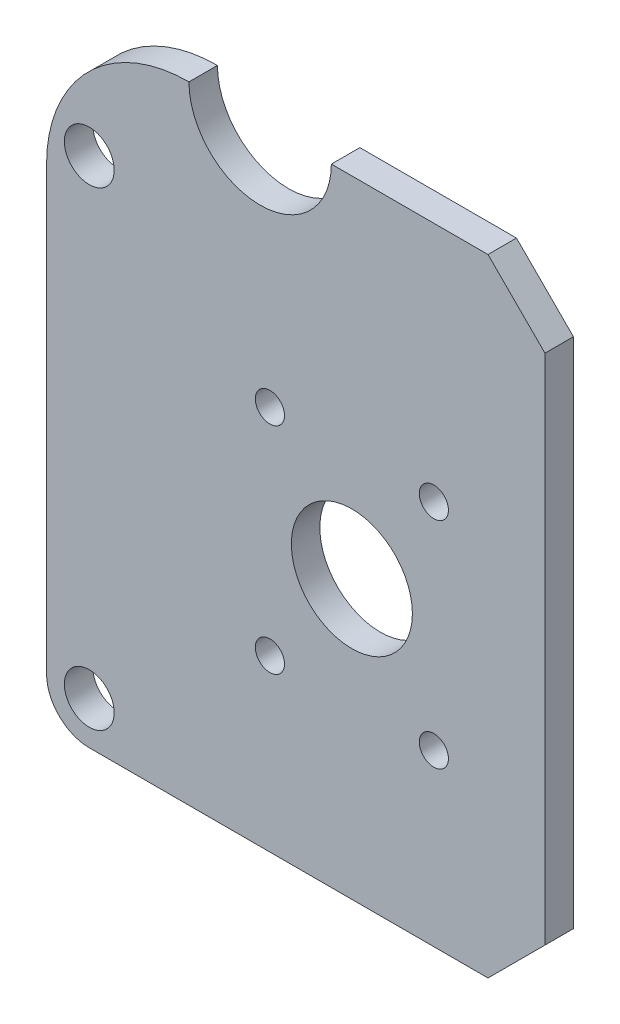
ISO-10303-21;
HEADER;
FILE_DESCRIPTION(('STEP AP214'),'2;1');
FILE_NAME('part.step','',(''),(''),'','','');
FILE_SCHEMA(('AUTOMOTIVE_DESIGN { 1 0 10303 214 1 1 1 1 }'));
ENDSEC;
DATA;
#1=APPLICATION_CONTEXT('core data for automotive mechanical design processes');
#2=APPLICATION_PROTOCOL_DEFINITION('international standard','automotive_design',2000,#1);
#3=PRODUCT_CONTEXT('',#1,'mechanical');
#4=PRODUCT('Part','Part','',(#3));
#5=PRODUCT_RELATED_PRODUCT_CATEGORY('part','',(#4));
#6=PRODUCT_DEFINITION_FORMATION('','',#4);
#7=PRODUCT_DEFINITION_CONTEXT('part definition',#1,'design');
#8=PRODUCT_DEFINITION('design','',#6,#7);
#9=PRODUCT_DEFINITION_SHAPE('','',#8);
#10=(LENGTH_UNIT() NAMED_UNIT(*) SI_UNIT(.MILLI.,.METRE.));
#11=(NAMED_UNIT(*) PLANE_ANGLE_UNIT() SI_UNIT($,.RADIAN.));
#12=(NAMED_UNIT(*) SI_UNIT($,.STERADIAN.) SOLID_ANGLE_UNIT());
#13=UNCERTAINTY_MEASURE_WITH_UNIT(LENGTH_MEASURE(1.E-05),#10,'distance_accuracy_value','');
#14=(GEOMETRIC_REPRESENTATION_CONTEXT(3) GLOBAL_UNCERTAINTY_ASSIGNED_CONTEXT((#13)) GLOBAL_UNIT_ASSIGNED_CONTEXT((#10,
#11,#12)) REPRESENTATION_CONTEXT('',''));
#15=CARTESIAN_POINT('',(0.,0.,0.));
#16=DIRECTION('',(0.,0.,1.));
#17=DIRECTION('',(1.,0.,0.));
#18=AXIS2_PLACEMENT_3D('',#15,#16,#17);
#19=CARTESIAN_POINT('',(-18.5,-19.5,2.));
#20=DIRECTION('',(0.,1.,0.));
#21=DIRECTION('',(0.,0.,1.));
#22=AXIS2_PLACEMENT_3D('',#19,#20,#21);
#23=PLANE('',#22);
#24=DIRECTION('',(1.,0.,0.));
#25=VECTOR('',#24,1.);
#26=CARTESIAN_POINT('',(-18.5,-19.5,0.));
#27=LINE('',#26,#25);
#28=CARTESIAN_POINT('',(-13.5,-19.5,0.));
#29=VERTEX_POINT('',#28);
#30=CARTESIAN_POINT('',(14.5,-19.5,0.));
#31=VERTEX_POINT('',#30);
#32=EDGE_CURVE('E167',#29,#31,#27,.T.);
#33=ORIENTED_EDGE('',*,*,#32,.T.);
#34=DIRECTION('',(0.,0.,1.));
#35=VECTOR('',#34,1.);
#36=CARTESIAN_POINT('',(14.5,-19.5,2.));
#37=LINE('',#36,#35);
#38=CARTESIAN_POINT('',(14.5,-19.5,2.));
#39=VERTEX_POINT('',#38);
#40=EDGE_CURVE('E206',#31,#39,#37,.T.);
#41=ORIENTED_EDGE('',*,*,#40,.T.);
#42=DIRECTION('',(1.,0.,0.));
#43=VECTOR('',#42,1.);
#44=CARTESIAN_POINT('',(-18.5,-19.5,2.));
#45=LINE('',#44,#43);
#46=CARTESIAN_POINT('',(-13.5,-19.5,2.));
#47=VERTEX_POINT('',#46);
#48=EDGE_CURVE('E170',#47,#39,#45,.T.);
#49=ORIENTED_EDGE('',*,*,#48,.F.);
#50=DIRECTION('',(0.,0.,1.));
#51=VECTOR('',#50,1.);
#52=CARTESIAN_POINT('',(-13.5,-19.5,2.));
#53=LINE('',#52,#51);
#54=EDGE_CURVE('E189',#47,#29,#53,.F.);
#55=ORIENTED_EDGE('',*,*,#54,.T.);
#56=EDGE_LOOP('',(#33,#41,#49,#55));
#57=FACE_BOUND('',#56,.T.);
#58=ADVANCED_FACE('F36',(#57),#23,.F.);
#59=CARTESIAN_POINT('',(18.5,19.5,2.));
#60=DIRECTION('',(-1.,0.,0.));
#61=DIRECTION('',(0.,0.,1.));
#62=AXIS2_PLACEMENT_3D('',#59,#60,#61);
#63=PLANE('',#62);
#64=DIRECTION('',(0.,1.,0.));
#65=VECTOR('',#64,1.);
#66=CARTESIAN_POINT('',(18.5,19.5,0.));
#67=LINE('',#66,#65);
#68=CARTESIAN_POINT('',(18.5,-15.5,0.));
#69=VERTEX_POINT('',#68);
#70=CARTESIAN_POINT('',(18.5,20.5,0.));
#71=VERTEX_POINT('',#70);
#72=EDGE_CURVE('E174',#69,#71,#67,.T.);
#73=ORIENTED_EDGE('',*,*,#72,.T.);
#74=DIRECTION('',(0.,0.,1.));
#75=VECTOR('',#74,1.);
#76=CARTESIAN_POINT('',(18.5,20.5,2.));
#77=LINE('',#76,#75);
#78=CARTESIAN_POINT('',(18.5,20.5,2.));
#79=VERTEX_POINT('',#78);
#80=EDGE_CURVE('E214',#71,#79,#77,.T.);
#81=ORIENTED_EDGE('',*,*,#80,.T.);
#82=DIRECTION('',(0.,1.,0.));
#83=VECTOR('',#82,1.);
#84=CARTESIAN_POINT('',(18.5,19.5,2.));
#85=LINE('',#84,#83);
#86=CARTESIAN_POINT('',(18.5,-15.5,2.));
#87=VERTEX_POINT('',#86);
#88=EDGE_CURVE('E173',#87,#79,#85,.T.);
#89=ORIENTED_EDGE('',*,*,#88,.F.);
#90=DIRECTION('',(0.,0.,-1.));
#91=VECTOR('',#90,1.);
#92=CARTESIAN_POINT('',(18.5,-15.5,2.));
#93=LINE('',#92,#91);
#94=EDGE_CURVE('E193',#87,#69,#93,.T.);
#95=ORIENTED_EDGE('',*,*,#94,.T.);
#96=EDGE_LOOP('',(#73,#81,#89,#95));
#97=FACE_BOUND('',#96,.T.);
#98=ADVANCED_FACE('F221',(#97),#63,.F.);
#99=CARTESIAN_POINT('',(-18.5,-19.5,2.));
#100=DIRECTION('',(0.,0.,1.));
#101=DIRECTION('',(1.,0.,0.));
#102=AXIS2_PLACEMENT_3D('',#99,#100,#101);
#103=PLANE('',#102);
#104=CARTESIAN_POINT('',(-1.5,24.5,2.));
#105=DIRECTION('',(0.,0.,1.));
#106=DIRECTION('',(1.,0.,0.));
#107=AXIS2_PLACEMENT_3D('',#104,#105,#106);
#108=CIRCLE('',#107,5.);
#109=CARTESIAN_POINT('',(-6.5,24.5,2.));
#110=VERTEX_POINT('',#109);
#111=CARTESIAN_POINT('',(3.5,24.5,2.));
#112=VERTEX_POINT('',#111);
#113=EDGE_CURVE('E107',#110,#112,#108,.T.);
#114=ORIENTED_EDGE('',*,*,#113,.F.);
#115=CARTESIAN_POINT('',(-6.5,14.5,2.));
#116=DIRECTION('',(0.,0.,1.));
#117=DIRECTION('',(1.,0.,0.));
#118=AXIS2_PLACEMENT_3D('',#115,#116,#117);
#119=CIRCLE('',#118,10.);
#120=CARTESIAN_POINT('',(-16.5,14.5,2.));
#121=VERTEX_POINT('',#120);
#122=EDGE_CURVE('E58',#110,#121,#119,.T.);
#123=ORIENTED_EDGE('',*,*,#122,.T.);
#124=DIRECTION('',(0.,1.,0.));
#125=VECTOR('',#124,1.);
#126=CARTESIAN_POINT('',(-16.5,19.5,2.));
#127=LINE('',#126,#125);
#128=CARTESIAN_POINT('',(-16.5,-16.5,2.));
#129=VERTEX_POINT('',#128);
#130=EDGE_CURVE('E151',#129,#121,#127,.T.);
#131=ORIENTED_EDGE('',*,*,#130,.F.);
#132=CARTESIAN_POINT('',(-13.5,-16.5,2.));
#133=DIRECTION('',(0.,0.,1.));
#134=DIRECTION('',(1.,0.,0.));
#135=AXIS2_PLACEMENT_3D('',#132,#133,#134);
#136=CIRCLE('',#135,3.);
#137=EDGE_CURVE('E187',#129,#47,#136,.T.);
#138=ORIENTED_EDGE('',*,*,#137,.T.);
#139=ORIENTED_EDGE('',*,*,#48,.T.);
#140=DIRECTION('',(-0.707106781186548,-0.707106781186547,0.));
#141=VECTOR('',#140,1.);
#142=CARTESIAN_POINT('',(-2.00000000000004,-36.,2.));
#143=LINE('',#142,#141);
#144=EDGE_CURVE('E208',#39,#87,#143,.F.);
#145=ORIENTED_EDGE('',*,*,#144,.T.);
#146=ORIENTED_EDGE('',*,*,#88,.T.);
#147=DIRECTION('',(-0.707106781186546,0.707106781186549,0.));
#148=VECTOR('',#147,1.);
#149=CARTESIAN_POINT('',(20.,18.9999999999999,2.));
#150=LINE('',#149,#148);
#151=CARTESIAN_POINT('',(14.5,24.5,2.));
#152=VERTEX_POINT('',#151);
#153=EDGE_CURVE('E130',#79,#152,#150,.T.);
#154=ORIENTED_EDGE('',*,*,#153,.T.);
#155=DIRECTION('',(1.,0.,0.));
#156=VECTOR('',#155,1.);
#157=CARTESIAN_POINT('',(-16.5,24.5,2.));
#158=LINE('',#157,#156);
#159=EDGE_CURVE('E121',#112,#152,#158,.T.);
#160=ORIENTED_EDGE('',*,*,#159,.F.);
#161=EDGE_LOOP('',(#114,#123,#131,#138,#139,#145,#146,#154,#160));
#162=FACE_BOUND('',#161,.T.);
#163=CARTESIAN_POINT('',(-0.816889802524288,-7.55699806812149,2.));
#164=DIRECTION('',(0.,0.,1.));
#165=DIRECTION('',(1.,0.,0.));
#166=AXIS2_PLACEMENT_3D('',#163,#164,#165);
#167=CIRCLE('',#166,1.025);
#168=CARTESIAN_POINT('',(0.208110197475711,-7.55699806812149,2.));
#169=VERTEX_POINT('',#168);
#170=EDGE_CURVE('E133',#169,#169,#167,.T.);
#171=ORIENTED_EDGE('',*,*,#170,.F.);
#172=EDGE_LOOP('',(#171));
#173=FACE_BOUND('',#172,.T.);
#174=CARTESIAN_POINT('',(10.6968898025243,7.55699806812149,2.));
#175=DIRECTION('',(0.,0.,1.));
#176=DIRECTION('',(1.,0.,0.));
#177=AXIS2_PLACEMENT_3D('',#174,#175,#176);
#178=CIRCLE('',#177,1.025);
#179=CARTESIAN_POINT('',(11.7218898025243,7.55699806812149,2.));
#180=VERTEX_POINT('',#179);
#181=EDGE_CURVE('E139',#180,#180,#178,.T.);
#182=ORIENTED_EDGE('',*,*,#181,.F.);
#183=EDGE_LOOP('',(#182));
#184=FACE_BOUND('',#183,.T.);
#185=CARTESIAN_POINT('',(-0.816889802524237,7.55699806812153,2.));
#186=DIRECTION('',(0.,0.,1.));
#187=DIRECTION('',(1.,0.,0.));
#188=AXIS2_PLACEMENT_3D('',#185,#186,#187);
#189=CIRCLE('',#188,1.025);
#190=CARTESIAN_POINT('',(0.208110197475762,7.55699806812153,2.));
#191=VERTEX_POINT('',#190);
#192=EDGE_CURVE('E143',#191,#191,#189,.T.);
#193=ORIENTED_EDGE('',*,*,#192,.F.);
#194=EDGE_LOOP('',(#193));
#195=FACE_BOUND('',#194,.T.);
#196=CARTESIAN_POINT('',(10.6968898025243,-7.55699806812152,2.));
#197=DIRECTION('',(0.,0.,1.));
#198=DIRECTION('',(1.,0.,0.));
#199=AXIS2_PLACEMENT_3D('',#196,#197,#198);
#200=CIRCLE('',#199,1.025);
#201=CARTESIAN_POINT('',(11.7218898025242,-7.55699806812152,2.));
#202=VERTEX_POINT('',#201);
#203=EDGE_CURVE('E147',#202,#202,#200,.T.);
#204=ORIENTED_EDGE('',*,*,#203,.F.);
#205=EDGE_LOOP('',(#204));
#206=FACE_BOUND('',#205,.T.);
#207=CARTESIAN_POINT('',(4.94000000000001,0.,2.));
#208=DIRECTION('',(0.,0.,1.));
#209=DIRECTION('',(1.,0.,0.));
#210=AXIS2_PLACEMENT_3D('',#207,#208,#209);
#211=CIRCLE('',#210,4.25);
#212=CARTESIAN_POINT('',(9.19,0.,2.));
#213=VERTEX_POINT('',#212);
#214=EDGE_CURVE('E153',#213,#213,#211,.T.);
#215=ORIENTED_EDGE('',*,*,#214,.F.);
#216=EDGE_LOOP('',(#215));
#217=FACE_BOUND('',#216,.T.);
#218=CARTESIAN_POINT('',(-13.5,-16.5,2.));
#219=DIRECTION('',(0.,0.,1.));
#220=DIRECTION('',(1.,0.,0.));
#221=AXIS2_PLACEMENT_3D('',#218,#219,#220);
#222=CIRCLE('',#221,1.75);
#223=CARTESIAN_POINT('',(-11.75,-16.5,2.));
#224=VERTEX_POINT('',#223);
#225=EDGE_CURVE('E161',#224,#224,#222,.T.);
#226=ORIENTED_EDGE('',*,*,#225,.F.);
#227=EDGE_LOOP('',(#226));
#228=FACE_BOUND('',#227,.T.);
#229=CARTESIAN_POINT('',(-13.5,16.5,2.));
#230=DIRECTION('',(0.,0.,1.));
#231=DIRECTION('',(1.,0.,0.));
#232=AXIS2_PLACEMENT_3D('',#229,#230,#231);
#233=CIRCLE('',#232,1.75);
#234=CARTESIAN_POINT('',(-11.75,16.5,2.));
#235=VERTEX_POINT('',#234);
#236=EDGE_CURVE('E160',#235,#235,#233,.T.);
#237=ORIENTED_EDGE('',*,*,#236,.F.);
#238=EDGE_LOOP('',(#237));
#239=FACE_BOUND('',#238,.T.);
#240=ADVANCED_FACE('F126',(#162,#173,#184,#195,#206,#217,#228,#239),#103,.T.);
#241=CARTESIAN_POINT('',(-18.5,-19.5,0.));
#242=DIRECTION('',(0.,0.,1.));
#243=DIRECTION('',(1.,0.,0.));
#244=AXIS2_PLACEMENT_3D('',#241,#242,#243);
#245=PLANE('',#244);
#246=CARTESIAN_POINT('',(-0.816889802524288,-7.55699806812149,0.));
#247=DIRECTION('',(0.,0.,1.));
#248=DIRECTION('',(1.,0.,0.));
#249=AXIS2_PLACEMENT_3D('',#246,#247,#248);
#250=CIRCLE('',#249,1.025);
#251=CARTESIAN_POINT('',(0.208110197475711,-7.55699806812149,0.));
#252=VERTEX_POINT('',#251);
#253=EDGE_CURVE('E138',#252,#252,#250,.T.);
#254=ORIENTED_EDGE('',*,*,#253,.T.);
#255=EDGE_LOOP('',(#254));
#256=FACE_BOUND('',#255,.T.);
#257=CARTESIAN_POINT('',(10.6968898025243,7.55699806812149,0.));
#258=DIRECTION('',(0.,0.,1.));
#259=DIRECTION('',(1.,0.,0.));
#260=AXIS2_PLACEMENT_3D('',#257,#258,#259);
#261=CIRCLE('',#260,1.025);
#262=CARTESIAN_POINT('',(11.7218898025243,7.55699806812149,0.));
#263=VERTEX_POINT('',#262);
#264=EDGE_CURVE('E142',#263,#263,#261,.T.);
#265=ORIENTED_EDGE('',*,*,#264,.T.);
#266=EDGE_LOOP('',(#265));
#267=FACE_BOUND('',#266,.T.);
#268=CARTESIAN_POINT('',(-0.816889802524237,7.55699806812153,0.));
#269=DIRECTION('',(0.,0.,1.));
#270=DIRECTION('',(1.,0.,0.));
#271=AXIS2_PLACEMENT_3D('',#268,#269,#270);
#272=CIRCLE('',#271,1.025);
#273=CARTESIAN_POINT('',(0.208110197475761,7.55699806812153,0.));
#274=VERTEX_POINT('',#273);
#275=EDGE_CURVE('E146',#274,#274,#272,.T.);
#276=ORIENTED_EDGE('',*,*,#275,.T.);
#277=EDGE_LOOP('',(#276));
#278=FACE_BOUND('',#277,.T.);
#279=CARTESIAN_POINT('',(10.6968898025243,-7.55699806812152,0.));
#280=DIRECTION('',(0.,0.,1.));
#281=DIRECTION('',(1.,0.,0.));
#282=AXIS2_PLACEMENT_3D('',#279,#280,#281);
#283=CIRCLE('',#282,1.025);
#284=CARTESIAN_POINT('',(11.7218898025242,-7.55699806812152,0.));
#285=VERTEX_POINT('',#284);
#286=EDGE_CURVE('E150',#285,#285,#283,.T.);
#287=ORIENTED_EDGE('',*,*,#286,.T.);
#288=EDGE_LOOP('',(#287));
#289=FACE_BOUND('',#288,.T.);
#290=CARTESIAN_POINT('',(4.94000000000001,0.,0.));
#291=DIRECTION('',(0.,0.,1.));
#292=DIRECTION('',(1.,0.,0.));
#293=AXIS2_PLACEMENT_3D('',#290,#291,#292);
#294=CIRCLE('',#293,4.25);
#295=CARTESIAN_POINT('',(9.19,0.,0.));
#296=VERTEX_POINT('',#295);
#297=EDGE_CURVE('E156',#296,#296,#294,.T.);
#298=ORIENTED_EDGE('',*,*,#297,.T.);
#299=EDGE_LOOP('',(#298));
#300=FACE_BOUND('',#299,.T.);
#301=CARTESIAN_POINT('',(-13.5,-16.5,0.));
#302=DIRECTION('',(0.,0.,1.));
#303=DIRECTION('',(1.,0.,0.));
#304=AXIS2_PLACEMENT_3D('',#301,#302,#303);
#305=CIRCLE('',#304,1.75);
#306=CARTESIAN_POINT('',(-11.75,-16.5,0.));
#307=VERTEX_POINT('',#306);
#308=EDGE_CURVE('E157',#307,#307,#305,.T.);
#309=ORIENTED_EDGE('',*,*,#308,.T.);
#310=EDGE_LOOP('',(#309));
#311=FACE_BOUND('',#310,.T.);
#312=CARTESIAN_POINT('',(-13.5,16.5,0.));
#313=DIRECTION('',(0.,0.,1.));
#314=DIRECTION('',(1.,0.,0.));
#315=AXIS2_PLACEMENT_3D('',#312,#313,#314);
#316=CIRCLE('',#315,1.75);
#317=CARTESIAN_POINT('',(-11.75,16.5,0.));
#318=VERTEX_POINT('',#317);
#319=EDGE_CURVE('E164',#318,#318,#316,.T.);
#320=ORIENTED_EDGE('',*,*,#319,.T.);
#321=EDGE_LOOP('',(#320));
#322=FACE_BOUND('',#321,.T.);
#323=CARTESIAN_POINT('',(-6.5,14.5,0.));
#324=DIRECTION('',(0.,0.,1.));
#325=DIRECTION('',(1.,0.,0.));
#326=AXIS2_PLACEMENT_3D('',#323,#324,#325);
#327=CIRCLE('',#326,10.);
#328=CARTESIAN_POINT('',(-16.5,14.5,0.));
#329=VERTEX_POINT('',#328);
#330=CARTESIAN_POINT('',(-6.5,24.5,0.));
#331=VERTEX_POINT('',#330);
#332=EDGE_CURVE('E11',#329,#331,#327,.F.);
#333=ORIENTED_EDGE('',*,*,#332,.T.);
#334=CARTESIAN_POINT('',(-1.5,24.5,0.));
#335=DIRECTION('',(0.,0.,1.));
#336=DIRECTION('',(1.,0.,0.));
#337=AXIS2_PLACEMENT_3D('',#334,#335,#336);
#338=CIRCLE('',#337,5.);
#339=CARTESIAN_POINT('',(3.5,24.5,0.));
#340=VERTEX_POINT('',#339);
#341=EDGE_CURVE('E115',#331,#340,#338,.T.);
#342=ORIENTED_EDGE('',*,*,#341,.T.);
#343=DIRECTION('',(-1.,0.,0.));
#344=VECTOR('',#343,1.);
#345=CARTESIAN_POINT('',(-16.5,24.5,0.));
#346=LINE('',#345,#344);
#347=CARTESIAN_POINT('',(14.5,24.5,0.));
#348=VERTEX_POINT('',#347);
#349=EDGE_CURVE('E124',#348,#340,#346,.T.);
#350=ORIENTED_EDGE('',*,*,#349,.F.);
#351=DIRECTION('',(0.707106781186546,-0.707106781186549,0.));
#352=VECTOR('',#351,1.);
#353=CARTESIAN_POINT('',(14.5,24.5,0.));
#354=LINE('',#353,#352);
#355=EDGE_CURVE('E212',#348,#71,#354,.T.);
#356=ORIENTED_EDGE('',*,*,#355,.T.);
#357=ORIENTED_EDGE('',*,*,#72,.F.);
#358=DIRECTION('',(0.707106781186548,0.707106781186547,0.));
#359=VECTOR('',#358,1.);
#360=CARTESIAN_POINT('',(18.5,-15.5,0.));
#361=LINE('',#360,#359);
#362=EDGE_CURVE('E204',#69,#31,#361,.F.);
#363=ORIENTED_EDGE('',*,*,#362,.T.);
#364=ORIENTED_EDGE('',*,*,#32,.F.);
#365=CARTESIAN_POINT('',(-13.5,-16.5,0.));
#366=DIRECTION('',(0.,0.,1.));
#367=DIRECTION('',(1.,0.,0.));
#368=AXIS2_PLACEMENT_3D('',#365,#366,#367);
#369=CIRCLE('',#368,3.);
#370=CARTESIAN_POINT('',(-16.5,-16.5,0.));
#371=VERTEX_POINT('',#370);
#372=EDGE_CURVE('E191',#29,#371,#369,.F.);
#373=ORIENTED_EDGE('',*,*,#372,.T.);
#374=DIRECTION('',(0.,1.,0.));
#375=VECTOR('',#374,1.);
#376=CARTESIAN_POINT('',(-16.5,-19.5,0.));
#377=LINE('',#376,#375);
#378=EDGE_CURVE('E176',#371,#329,#377,.T.);
#379=ORIENTED_EDGE('',*,*,#378,.T.);
#380=EDGE_LOOP('',(#333,#342,#350,#356,#357,#363,#364,#373,#379));
#381=FACE_BOUND('',#380,.T.);
#382=ADVANCED_FACE('F228',(#256,#267,#278,#289,#300,#311,#322,#381),#245,.F.);
#383=CARTESIAN_POINT('',(-13.5,16.5,0.));
#384=DIRECTION('',(0.,0.,1.));
#385=DIRECTION('',(1.,0.,0.));
#386=AXIS2_PLACEMENT_3D('',#383,#384,#385);
#387=CYLINDRICAL_SURFACE('',#386,1.75);
#388=ORIENTED_EDGE('',*,*,#319,.F.);
#389=EDGE_LOOP('',(#388));
#390=FACE_BOUND('',#389,.T.);
#391=ORIENTED_EDGE('',*,*,#236,.T.);
#392=EDGE_LOOP('',(#391));
#393=FACE_BOUND('',#392,.T.);
#394=ADVANCED_FACE('F285',(#390,#393),#387,.F.);
#395=CARTESIAN_POINT('',(-13.5,-16.5,0.));
#396=DIRECTION('',(0.,0.,1.));
#397=DIRECTION('',(1.,0.,0.));
#398=AXIS2_PLACEMENT_3D('',#395,#396,#397);
#399=CYLINDRICAL_SURFACE('',#398,1.75);
#400=ORIENTED_EDGE('',*,*,#308,.F.);
#401=EDGE_LOOP('',(#400));
#402=FACE_BOUND('',#401,.T.);
#403=ORIENTED_EDGE('',*,*,#225,.T.);
#404=EDGE_LOOP('',(#403));
#405=FACE_BOUND('',#404,.T.);
#406=ADVANCED_FACE('F277',(#402,#405),#399,.F.);
#407=CARTESIAN_POINT('',(4.94000000000001,0.,-8.));
#408=DIRECTION('',(0.,0.,1.));
#409=DIRECTION('',(1.,0.,0.));
#410=AXIS2_PLACEMENT_3D('',#407,#408,#409);
#411=CYLINDRICAL_SURFACE('',#410,4.25);
#412=ORIENTED_EDGE('',*,*,#214,.T.);
#413=EDGE_LOOP('',(#412));
#414=FACE_BOUND('',#413,.T.);
#415=ORIENTED_EDGE('',*,*,#297,.F.);
#416=EDGE_LOOP('',(#415));
#417=FACE_BOUND('',#416,.T.);
#418=ADVANCED_FACE('F272',(#414,#417),#411,.F.);
#419=CARTESIAN_POINT('',(-16.5,19.5,-8.));
#420=DIRECTION('',(1.,0.,0.));
#421=DIRECTION('',(0.,1.,0.));
#422=AXIS2_PLACEMENT_3D('',#419,#420,#421);
#423=PLANE('',#422);
#424=ORIENTED_EDGE('',*,*,#130,.T.);
#425=DIRECTION('',(0.,0.,1.));
#426=VECTOR('',#425,1.);
#427=CARTESIAN_POINT('',(-16.5,14.5,0.));
#428=LINE('',#427,#426);
#429=EDGE_CURVE('E44',#121,#329,#428,.F.);
#430=ORIENTED_EDGE('',*,*,#429,.T.);
#431=ORIENTED_EDGE('',*,*,#378,.F.);
#432=DIRECTION('',(0.,0.,1.));
#433=VECTOR('',#432,1.);
#434=CARTESIAN_POINT('',(-16.5,-16.5,-8.));
#435=LINE('',#434,#433);
#436=EDGE_CURVE('E184',#371,#129,#435,.T.);
#437=ORIENTED_EDGE('',*,*,#436,.T.);
#438=EDGE_LOOP('',(#424,#430,#431,#437));
#439=FACE_BOUND('',#438,.T.);
#440=ADVANCED_FACE('F251',(#439),#423,.F.);
#441=CARTESIAN_POINT('',(-13.5,-16.5,-8.));
#442=DIRECTION('',(0.,0.,1.));
#443=DIRECTION('',(1.,0.,0.));
#444=AXIS2_PLACEMENT_3D('',#441,#442,#443);
#445=CYLINDRICAL_SURFACE('',#444,3.);
#446=ORIENTED_EDGE('',*,*,#372,.F.);
#447=ORIENTED_EDGE('',*,*,#54,.F.);
#448=ORIENTED_EDGE('',*,*,#137,.F.);
#449=ORIENTED_EDGE('',*,*,#436,.F.);
#450=EDGE_LOOP('',(#446,#447,#448,#449));
#451=FACE_BOUND('',#450,.T.);
#452=ADVANCED_FACE('F247',(#451),#445,.T.);
#453=CARTESIAN_POINT('',(10.6968898025243,-7.55699806812152,2.));
#454=DIRECTION('',(0.,0.,1.));
#455=DIRECTION('',(1.,0.,0.));
#456=AXIS2_PLACEMENT_3D('',#453,#454,#455);
#457=CYLINDRICAL_SURFACE('',#456,1.025);
#458=ORIENTED_EDGE('',*,*,#203,.T.);
#459=EDGE_LOOP('',(#458));
#460=FACE_BOUND('',#459,.T.);
#461=ORIENTED_EDGE('',*,*,#286,.F.);
#462=EDGE_LOOP('',(#461));
#463=FACE_BOUND('',#462,.T.);
#464=ADVANCED_FACE('F250',(#460,#463),#457,.F.);
#465=CARTESIAN_POINT('',(-0.816889802524237,7.55699806812153,2.));
#466=DIRECTION('',(0.,0.,1.));
#467=DIRECTION('',(1.,0.,0.));
#468=AXIS2_PLACEMENT_3D('',#465,#466,#467);
#469=CYLINDRICAL_SURFACE('',#468,1.025);
#470=ORIENTED_EDGE('',*,*,#192,.T.);
#471=EDGE_LOOP('',(#470));
#472=FACE_BOUND('',#471,.T.);
#473=ORIENTED_EDGE('',*,*,#275,.F.);
#474=EDGE_LOOP('',(#473));
#475=FACE_BOUND('',#474,.T.);
#476=ADVANCED_FACE('F317',(#472,#475),#469,.F.);
#477=CARTESIAN_POINT('',(10.6968898025243,7.55699806812149,2.));
#478=DIRECTION('',(0.,0.,1.));
#479=DIRECTION('',(1.,0.,0.));
#480=AXIS2_PLACEMENT_3D('',#477,#478,#479);
#481=CYLINDRICAL_SURFACE('',#480,1.025);
#482=ORIENTED_EDGE('',*,*,#181,.T.);
#483=EDGE_LOOP('',(#482));
#484=FACE_BOUND('',#483,.T.);
#485=ORIENTED_EDGE('',*,*,#264,.F.);
#486=EDGE_LOOP('',(#485));
#487=FACE_BOUND('',#486,.T.);
#488=ADVANCED_FACE('F262',(#484,#487),#481,.F.);
#489=CARTESIAN_POINT('',(-0.816889802524288,-7.55699806812149,2.));
#490=DIRECTION('',(0.,0.,1.));
#491=DIRECTION('',(1.,0.,0.));
#492=AXIS2_PLACEMENT_3D('',#489,#490,#491);
#493=CYLINDRICAL_SURFACE('',#492,1.025);
#494=ORIENTED_EDGE('',*,*,#170,.T.);
#495=EDGE_LOOP('',(#494));
#496=FACE_BOUND('',#495,.T.);
#497=ORIENTED_EDGE('',*,*,#253,.F.);
#498=EDGE_LOOP('',(#497));
#499=FACE_BOUND('',#498,.T.);
#500=ADVANCED_FACE('F255',(#496,#499),#493,.F.);
#501=CARTESIAN_POINT('',(18.5,-15.5,2.));
#502=DIRECTION('',(-0.707106781186547,0.707106781186548,0.));
#503=DIRECTION('',(-0.707106781186548,-0.707106781186547,0.));
#504=AXIS2_PLACEMENT_3D('',#501,#502,#503);
#505=PLANE('',#504);
#506=ORIENTED_EDGE('',*,*,#144,.F.);
#507=ORIENTED_EDGE('',*,*,#40,.F.);
#508=ORIENTED_EDGE('',*,*,#362,.F.);
#509=ORIENTED_EDGE('',*,*,#94,.F.);
#510=EDGE_LOOP('',(#506,#507,#508,#509));
#511=FACE_BOUND('',#510,.T.);
#512=ADVANCED_FACE('F253',(#511),#505,.F.);
#513=CARTESIAN_POINT('',(-16.5,24.5,2.));
#514=DIRECTION('',(0.,1.,0.));
#515=DIRECTION('',(0.,0.,1.));
#516=AXIS2_PLACEMENT_3D('',#513,#514,#515);
#517=PLANE('',#516);
#518=DIRECTION('',(0.,0.,1.));
#519=VECTOR('',#518,1.);
#520=CARTESIAN_POINT('',(3.5,24.5,0.));
#521=LINE('',#520,#519);
#522=EDGE_CURVE('E110',#112,#340,#521,.F.);
#523=ORIENTED_EDGE('',*,*,#522,.F.);
#524=ORIENTED_EDGE('',*,*,#159,.T.);
#525=DIRECTION('',(0.,0.,-1.));
#526=VECTOR('',#525,1.);
#527=CARTESIAN_POINT('',(14.5,24.5,0.));
#528=LINE('',#527,#526);
#529=EDGE_CURVE('E210',#152,#348,#528,.T.);
#530=ORIENTED_EDGE('',*,*,#529,.T.);
#531=ORIENTED_EDGE('',*,*,#349,.T.);
#532=EDGE_LOOP('',(#523,#524,#530,#531));
#533=FACE_BOUND('',#532,.T.);
#534=ADVANCED_FACE('F119',(#533),#517,.T.);
#535=CARTESIAN_POINT('',(14.5,24.5,2.));
#536=DIRECTION('',(0.707106781186549,0.707106781186546,0.));
#537=DIRECTION('',(-0.707106781186546,0.707106781186549,0.));
#538=AXIS2_PLACEMENT_3D('',#535,#536,#537);
#539=PLANE('',#538);
#540=ORIENTED_EDGE('',*,*,#153,.F.);
#541=ORIENTED_EDGE('',*,*,#80,.F.);
#542=ORIENTED_EDGE('',*,*,#355,.F.);
#543=ORIENTED_EDGE('',*,*,#529,.F.);
#544=EDGE_LOOP('',(#540,#541,#542,#543));
#545=FACE_BOUND('',#544,.T.);
#546=ADVANCED_FACE('F226',(#545),#539,.T.);
#547=CARTESIAN_POINT('',(-6.5,14.5,2.));
#548=DIRECTION('',(0.,0.,-1.));
#549=DIRECTION('',(-1.,0.,0.));
#550=AXIS2_PLACEMENT_3D('',#547,#548,#549);
#551=CYLINDRICAL_SURFACE('',#550,10.);
#552=ORIENTED_EDGE('',*,*,#332,.F.);
#553=ORIENTED_EDGE('',*,*,#429,.F.);
#554=ORIENTED_EDGE('',*,*,#122,.F.);
#555=DIRECTION('',(0.,0.,1.));
#556=VECTOR('',#555,1.);
#557=CARTESIAN_POINT('',(-6.5,24.5,2.));
#558=LINE('',#557,#556);
#559=EDGE_CURVE('E113',#331,#110,#558,.T.);
#560=ORIENTED_EDGE('',*,*,#559,.F.);
#561=EDGE_LOOP('',(#552,#553,#554,#560));
#562=FACE_BOUND('',#561,.T.);
#563=ADVANCED_FACE('F38',(#562),#551,.T.);
#564=CARTESIAN_POINT('',(-1.5,24.5,0.));
#565=DIRECTION('',(0.,0.,1.));
#566=DIRECTION('',(1.,0.,0.));
#567=AXIS2_PLACEMENT_3D('',#564,#565,#566);
#568=CYLINDRICAL_SURFACE('',#567,5.);
#569=ORIENTED_EDGE('',*,*,#522,.T.);
#570=ORIENTED_EDGE('',*,*,#341,.F.);
#571=ORIENTED_EDGE('',*,*,#559,.T.);
#572=ORIENTED_EDGE('',*,*,#113,.T.);
#573=EDGE_LOOP('',(#569,#570,#571,#572));
#574=FACE_BOUND('',#573,.T.);
#575=ADVANCED_FACE('F109',(#574),#568,.F.);
#576=CLOSED_SHELL('',(#58,#98,#240,#382,#394,#406,#418,#440,#452,#464,#476,#488,#500,#512,#534,
#546,#563,#575));
#577=MANIFOLD_SOLID_BREP('B2',#576);
#578=ADVANCED_BREP_SHAPE_REPRESENTATION('',(#18,#577),#14);
#579=SHAPE_DEFINITION_REPRESENTATION(#9,#578);
ENDSEC;
END-ISO-10303-21;
